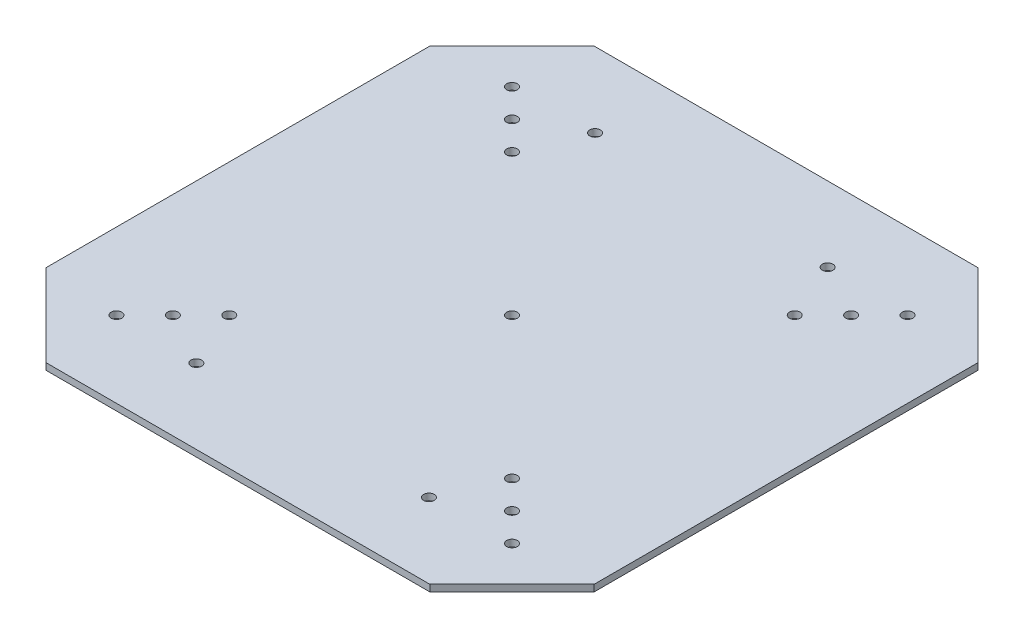
ISO-10303-21;
HEADER;
FILE_DESCRIPTION(('STEP AP214'),'2;1');
FILE_NAME('part.step','',(''),(''),'','','');
FILE_SCHEMA(('AUTOMOTIVE_DESIGN { 1 0 10303 214 1 1 1 1 }'));
ENDSEC;
DATA;
#1=APPLICATION_CONTEXT('core data for automotive mechanical design processes');
#2=APPLICATION_PROTOCOL_DEFINITION('international standard','automotive_design',2000,#1);
#3=PRODUCT_CONTEXT('',#1,'mechanical');
#4=PRODUCT('Part','Part','',(#3));
#5=PRODUCT_RELATED_PRODUCT_CATEGORY('part','',(#4));
#6=PRODUCT_DEFINITION_FORMATION('','',#4);
#7=PRODUCT_DEFINITION_CONTEXT('part definition',#1,'design');
#8=PRODUCT_DEFINITION('design','',#6,#7);
#9=PRODUCT_DEFINITION_SHAPE('','',#8);
#10=(LENGTH_UNIT() NAMED_UNIT(*) SI_UNIT(.MILLI.,.METRE.));
#11=(NAMED_UNIT(*) PLANE_ANGLE_UNIT() SI_UNIT($,.RADIAN.));
#12=(NAMED_UNIT(*) SI_UNIT($,.STERADIAN.) SOLID_ANGLE_UNIT());
#13=UNCERTAINTY_MEASURE_WITH_UNIT(LENGTH_MEASURE(1.E-05),#10,'distance_accuracy_value','');
#14=(GEOMETRIC_REPRESENTATION_CONTEXT(3) GLOBAL_UNCERTAINTY_ASSIGNED_CONTEXT((#13)) GLOBAL_UNIT_ASSIGNED_CONTEXT((#10,
#11,#12)) REPRESENTATION_CONTEXT('',''));
#15=CARTESIAN_POINT('',(0.,0.,0.));
#16=DIRECTION('',(0.,0.,1.));
#17=DIRECTION('',(1.,0.,0.));
#18=AXIS2_PLACEMENT_3D('',#15,#16,#17);
#19=CARTESIAN_POINT('',(0.,0.,0.));
#20=DIRECTION('',(0.,-1.,0.));
#21=DIRECTION('',(0.,0.,-1.));
#22=AXIS2_PLACEMENT_3D('',#19,#20,#21);
#23=PLANE('',#22);
#24=CARTESIAN_POINT('',(0.,0.,0.));
#25=DIRECTION('',(0.,1.,0.));
#26=DIRECTION('',(0.,0.,1.));
#27=AXIS2_PLACEMENT_3D('',#24,#25,#26);
#28=CIRCLE('',#27,1.59999999999999);
#29=CARTESIAN_POINT('',(0.,0.,1.59999999999999));
#30=VERTEX_POINT('',#29);
#31=EDGE_CURVE('E274',#30,#30,#28,.T.);
#32=ORIENTED_EDGE('',*,*,#31,.T.);
#33=EDGE_LOOP('',(#32));
#34=FACE_BOUND('',#33,.T.);
#35=CARTESIAN_POINT('',(-35.,0.,-60.));
#36=DIRECTION('',(0.,1.,0.));
#37=DIRECTION('',(0.,0.,1.));
#38=AXIS2_PLACEMENT_3D('',#35,#36,#37);
#39=CIRCLE('',#38,1.59999999999998);
#40=CARTESIAN_POINT('',(-35.,0.,-58.4));
#41=VERTEX_POINT('',#40);
#42=EDGE_CURVE('E268',#41,#41,#39,.T.);
#43=ORIENTED_EDGE('',*,*,#42,.T.);
#44=EDGE_LOOP('',(#43));
#45=FACE_BOUND('',#44,.T.);
#46=CARTESIAN_POINT('',(35.,0.,60.));
#47=DIRECTION('',(0.,1.,0.));
#48=DIRECTION('',(0.,0.,1.));
#49=AXIS2_PLACEMENT_3D('',#46,#47,#48);
#50=CIRCLE('',#49,1.59999999999998);
#51=CARTESIAN_POINT('',(35.,0.,61.6));
#52=VERTEX_POINT('',#51);
#53=EDGE_CURVE('E262',#52,#52,#50,.T.);
#54=ORIENTED_EDGE('',*,*,#53,.T.);
#55=EDGE_LOOP('',(#54));
#56=FACE_BOUND('',#55,.T.);
#57=CARTESIAN_POINT('',(35.,0.,-60.));
#58=DIRECTION('',(0.,1.,0.));
#59=DIRECTION('',(0.,0.,1.));
#60=AXIS2_PLACEMENT_3D('',#57,#58,#59);
#61=CIRCLE('',#60,1.59999999999998);
#62=CARTESIAN_POINT('',(35.,0.,-58.4));
#63=VERTEX_POINT('',#62);
#64=EDGE_CURVE('E256',#63,#63,#61,.T.);
#65=ORIENTED_EDGE('',*,*,#64,.T.);
#66=EDGE_LOOP('',(#65));
#67=FACE_BOUND('',#66,.T.);
#68=DIRECTION('',(-0.707106781186548,0.,-0.707106781186548));
#69=VECTOR('',#68,1.);
#70=CARTESIAN_POINT('',(57.7512626584708,0.,-82.5));
#71=LINE('',#70,#69);
#72=CARTESIAN_POINT('',(82.5,0.,-57.7512626584708));
#73=VERTEX_POINT('',#72);
#74=CARTESIAN_POINT('',(57.7512626584708,0.,-82.5));
#75=VERTEX_POINT('',#74);
#76=EDGE_CURVE('E131',#73,#75,#71,.T.);
#77=ORIENTED_EDGE('',*,*,#76,.F.);
#78=DIRECTION('',(0.,0.,-1.));
#79=VECTOR('',#78,1.);
#80=CARTESIAN_POINT('',(82.5,0.,-57.7512626584708));
#81=LINE('',#80,#79);
#82=CARTESIAN_POINT('',(82.5,0.,57.7512626584708));
#83=VERTEX_POINT('',#82);
#84=EDGE_CURVE('E85',#83,#73,#81,.T.);
#85=ORIENTED_EDGE('',*,*,#84,.F.);
#86=DIRECTION('',(0.707106781186548,0.,-0.707106781186548));
#87=VECTOR('',#86,1.);
#88=CARTESIAN_POINT('',(82.5,0.,57.7512626584708));
#89=LINE('',#88,#87);
#90=CARTESIAN_POINT('',(57.7512626584708,0.,82.5));
#91=VERTEX_POINT('',#90);
#92=EDGE_CURVE('E79',#91,#83,#89,.T.);
#93=ORIENTED_EDGE('',*,*,#92,.F.);
#94=DIRECTION('',(1.,0.,0.));
#95=VECTOR('',#94,1.);
#96=CARTESIAN_POINT('',(-57.7512626584709,0.,82.5));
#97=LINE('',#96,#95);
#98=CARTESIAN_POINT('',(-57.7512626584709,0.,82.5));
#99=VERTEX_POINT('',#98);
#100=EDGE_CURVE('E121',#99,#91,#97,.T.);
#101=ORIENTED_EDGE('',*,*,#100,.F.);
#102=DIRECTION('',(0.707106781186548,0.,0.707106781186548));
#103=VECTOR('',#102,1.);
#104=CARTESIAN_POINT('',(-82.5,0.,57.7512626584708));
#105=LINE('',#104,#103);
#106=CARTESIAN_POINT('',(-82.5,0.,57.7512626584708));
#107=VERTEX_POINT('',#106);
#108=EDGE_CURVE('E141',#107,#99,#105,.T.);
#109=ORIENTED_EDGE('',*,*,#108,.F.);
#110=DIRECTION('',(0.,0.,1.));
#111=VECTOR('',#110,1.);
#112=CARTESIAN_POINT('',(-82.5,0.,-57.7512626584708));
#113=LINE('',#112,#111);
#114=CARTESIAN_POINT('',(-82.5,0.,-57.7512626584708));
#115=VERTEX_POINT('',#114);
#116=EDGE_CURVE('E139',#115,#107,#113,.T.);
#117=ORIENTED_EDGE('',*,*,#116,.F.);
#118=DIRECTION('',(-0.707106781186548,0.,0.707106781186548));
#119=VECTOR('',#118,1.);
#120=CARTESIAN_POINT('',(-57.7512626584709,0.,-82.5));
#121=LINE('',#120,#119);
#122=CARTESIAN_POINT('',(-57.7512626584709,0.,-82.5));
#123=VERTEX_POINT('',#122);
#124=EDGE_CURVE('E137',#123,#115,#121,.T.);
#125=ORIENTED_EDGE('',*,*,#124,.F.);
#126=DIRECTION('',(-1.,0.,0.));
#127=VECTOR('',#126,1.);
#128=CARTESIAN_POINT('',(-57.7512626584709,0.,-82.5));
#129=LINE('',#128,#127);
#130=EDGE_CURVE('E134',#75,#123,#129,.T.);
#131=ORIENTED_EDGE('',*,*,#130,.F.);
#132=EDGE_LOOP('',(#77,#85,#93,#101,#109,#117,#125,#131));
#133=FACE_BOUND('',#132,.T.);
#134=CARTESIAN_POINT('',(-42.5484668629601,0.,42.5484668629601));
#135=DIRECTION('',(0.,-1.,0.));
#136=DIRECTION('',(0.,0.,-1.));
#137=AXIS2_PLACEMENT_3D('',#134,#135,#136);
#138=CIRCLE('',#137,1.59999999999999);
#139=CARTESIAN_POINT('',(-42.5484668629601,0.,40.9484668629601));
#140=VERTEX_POINT('',#139);
#141=EDGE_CURVE('E181',#140,#140,#138,.T.);
#142=ORIENTED_EDGE('',*,*,#141,.F.);
#143=EDGE_LOOP('',(#142));
#144=FACE_BOUND('',#143,.T.);
#145=CARTESIAN_POINT('',(-51.0337482371987,0.,51.0337482371986));
#146=DIRECTION('',(0.,-1.,0.));
#147=DIRECTION('',(0.,0.,-1.));
#148=AXIS2_PLACEMENT_3D('',#145,#146,#147);
#149=CIRCLE('',#148,1.59999999999999);
#150=CARTESIAN_POINT('',(-51.0337482371987,0.,49.4337482371986));
#151=VERTEX_POINT('',#150);
#152=EDGE_CURVE('E187',#151,#151,#149,.T.);
#153=ORIENTED_EDGE('',*,*,#152,.F.);
#154=EDGE_LOOP('',(#153));
#155=FACE_BOUND('',#154,.T.);
#156=CARTESIAN_POINT('',(-59.5190296114372,0.,59.5190296114372));
#157=DIRECTION('',(0.,-1.,0.));
#158=DIRECTION('',(0.,0.,-1.));
#159=AXIS2_PLACEMENT_3D('',#156,#157,#158);
#160=CIRCLE('',#159,1.59999999999999);
#161=CARTESIAN_POINT('',(-59.5190296114372,0.,57.9190296114372));
#162=VERTEX_POINT('',#161);
#163=EDGE_CURVE('E193',#162,#162,#160,.T.);
#164=ORIENTED_EDGE('',*,*,#163,.F.);
#165=EDGE_LOOP('',(#164));
#166=FACE_BOUND('',#165,.T.);
#167=CARTESIAN_POINT('',(42.54846686296,0.,-42.5484668629601));
#168=DIRECTION('',(0.,-1.,0.));
#169=DIRECTION('',(0.,0.,-1.));
#170=AXIS2_PLACEMENT_3D('',#167,#168,#169);
#171=CIRCLE('',#170,1.59999999999999);
#172=CARTESIAN_POINT('',(42.54846686296,0.,-44.1484668629601));
#173=VERTEX_POINT('',#172);
#174=EDGE_CURVE('E199',#173,#173,#171,.T.);
#175=ORIENTED_EDGE('',*,*,#174,.F.);
#176=EDGE_LOOP('',(#175));
#177=FACE_BOUND('',#176,.T.);
#178=CARTESIAN_POINT('',(51.0337482371986,0.,-51.0337482371987));
#179=DIRECTION('',(0.,-1.,0.));
#180=DIRECTION('',(0.,0.,-1.));
#181=AXIS2_PLACEMENT_3D('',#178,#179,#180);
#182=CIRCLE('',#181,1.59999999999999);
#183=CARTESIAN_POINT('',(51.0337482371986,0.,-52.6337482371987));
#184=VERTEX_POINT('',#183);
#185=EDGE_CURVE('E205',#184,#184,#182,.T.);
#186=ORIENTED_EDGE('',*,*,#185,.F.);
#187=EDGE_LOOP('',(#186));
#188=FACE_BOUND('',#187,.T.);
#189=CARTESIAN_POINT('',(59.5190296114372,0.,-59.5190296114372));
#190=DIRECTION('',(0.,-1.,0.));
#191=DIRECTION('',(0.,0.,-1.));
#192=AXIS2_PLACEMENT_3D('',#189,#190,#191);
#193=CIRCLE('',#192,1.59999999999998);
#194=CARTESIAN_POINT('',(59.5190296114372,0.,-61.1190296114372));
#195=VERTEX_POINT('',#194);
#196=EDGE_CURVE('E211',#195,#195,#193,.T.);
#197=ORIENTED_EDGE('',*,*,#196,.F.);
#198=EDGE_LOOP('',(#197));
#199=FACE_BOUND('',#198,.T.);
#200=CARTESIAN_POINT('',(42.54846686296,0.,42.5484668629601));
#201=DIRECTION('',(0.,-1.,0.));
#202=DIRECTION('',(0.,0.,-1.));
#203=AXIS2_PLACEMENT_3D('',#200,#201,#202);
#204=CIRCLE('',#203,1.59999999999998);
#205=CARTESIAN_POINT('',(42.54846686296,0.,40.9484668629601));
#206=VERTEX_POINT('',#205);
#207=EDGE_CURVE('E217',#206,#206,#204,.T.);
#208=ORIENTED_EDGE('',*,*,#207,.F.);
#209=EDGE_LOOP('',(#208));
#210=FACE_BOUND('',#209,.T.);
#211=CARTESIAN_POINT('',(51.0337482371986,0.,51.0337482371987));
#212=DIRECTION('',(0.,-1.,0.));
#213=DIRECTION('',(0.,0.,-1.));
#214=AXIS2_PLACEMENT_3D('',#211,#212,#213);
#215=CIRCLE('',#214,1.59999999999998);
#216=CARTESIAN_POINT('',(51.0337482371986,0.,49.4337482371987));
#217=VERTEX_POINT('',#216);
#218=EDGE_CURVE('E223',#217,#217,#215,.T.);
#219=ORIENTED_EDGE('',*,*,#218,.F.);
#220=EDGE_LOOP('',(#219));
#221=FACE_BOUND('',#220,.T.);
#222=CARTESIAN_POINT('',(59.5190296114372,0.,59.5190296114372));
#223=DIRECTION('',(0.,-1.,0.));
#224=DIRECTION('',(0.,0.,-1.));
#225=AXIS2_PLACEMENT_3D('',#222,#223,#224);
#226=CIRCLE('',#225,1.59999999999998);
#227=CARTESIAN_POINT('',(59.5190296114372,0.,57.9190296114372));
#228=VERTEX_POINT('',#227);
#229=EDGE_CURVE('E229',#228,#228,#226,.T.);
#230=ORIENTED_EDGE('',*,*,#229,.F.);
#231=EDGE_LOOP('',(#230));
#232=FACE_BOUND('',#231,.T.);
#233=CARTESIAN_POINT('',(-42.5484668629601,0.,-42.5484668629601));
#234=DIRECTION('',(0.,-1.,0.));
#235=DIRECTION('',(0.,0.,-1.));
#236=AXIS2_PLACEMENT_3D('',#233,#234,#235);
#237=CIRCLE('',#236,1.59999999999999);
#238=CARTESIAN_POINT('',(-42.5484668629601,0.,-44.1484668629601));
#239=VERTEX_POINT('',#238);
#240=EDGE_CURVE('E235',#239,#239,#237,.T.);
#241=ORIENTED_EDGE('',*,*,#240,.F.);
#242=EDGE_LOOP('',(#241));
#243=FACE_BOUND('',#242,.T.);
#244=CARTESIAN_POINT('',(-51.0337482371987,0.,-51.0337482371986));
#245=DIRECTION('',(0.,-1.,0.));
#246=DIRECTION('',(0.,0.,-1.));
#247=AXIS2_PLACEMENT_3D('',#244,#245,#246);
#248=CIRCLE('',#247,1.59999999999999);
#249=CARTESIAN_POINT('',(-51.0337482371987,0.,-52.6337482371986));
#250=VERTEX_POINT('',#249);
#251=EDGE_CURVE('E241',#250,#250,#248,.T.);
#252=ORIENTED_EDGE('',*,*,#251,.F.);
#253=EDGE_LOOP('',(#252));
#254=FACE_BOUND('',#253,.T.);
#255=CARTESIAN_POINT('',(-59.5190296114373,0.,-59.5190296114372));
#256=DIRECTION('',(0.,-1.,0.));
#257=DIRECTION('',(0.,0.,-1.));
#258=AXIS2_PLACEMENT_3D('',#255,#256,#257);
#259=CIRCLE('',#258,1.59999999999998);
#260=CARTESIAN_POINT('',(-59.5190296114373,0.,-61.1190296114372));
#261=VERTEX_POINT('',#260);
#262=EDGE_CURVE('E247',#261,#261,#259,.T.);
#263=ORIENTED_EDGE('',*,*,#262,.F.);
#264=EDGE_LOOP('',(#263));
#265=FACE_BOUND('',#264,.T.);
#266=CARTESIAN_POINT('',(-35.,0.,60.));
#267=DIRECTION('',(0.,1.,0.));
#268=DIRECTION('',(0.,0.,1.));
#269=AXIS2_PLACEMENT_3D('',#266,#267,#268);
#270=CIRCLE('',#269,1.59999999999998);
#271=CARTESIAN_POINT('',(-35.,0.,61.6));
#272=VERTEX_POINT('',#271);
#273=EDGE_CURVE('E250',#272,#272,#270,.T.);
#274=ORIENTED_EDGE('',*,*,#273,.T.);
#275=EDGE_LOOP('',(#274));
#276=FACE_BOUND('',#275,.T.);
#277=ADVANCED_FACE('F33',(#34,#45,#56,#67,#133,#144,#155,#166,#177,#188,#199,#210,#221,#232,
#243,#254,#265,#276),#23,.T.);
#278=CARTESIAN_POINT('',(0.,2.,0.));
#279=DIRECTION('',(0.,-1.,0.));
#280=DIRECTION('',(0.,0.,-1.));
#281=AXIS2_PLACEMENT_3D('',#278,#279,#280);
#282=PLANE('',#281);
#283=CARTESIAN_POINT('',(0.,2.,0.));
#284=DIRECTION('',(0.,1.,0.));
#285=DIRECTION('',(0.,0.,1.));
#286=AXIS2_PLACEMENT_3D('',#283,#284,#285);
#287=CIRCLE('',#286,1.59999999999999);
#288=CARTESIAN_POINT('',(0.,2.,1.59999999999999));
#289=VERTEX_POINT('',#288);
#290=EDGE_CURVE('E277',#289,#289,#287,.T.);
#291=ORIENTED_EDGE('',*,*,#290,.F.);
#292=EDGE_LOOP('',(#291));
#293=FACE_BOUND('',#292,.T.);
#294=CARTESIAN_POINT('',(-35.,2.,-60.));
#295=DIRECTION('',(0.,1.,0.));
#296=DIRECTION('',(0.,0.,1.));
#297=AXIS2_PLACEMENT_3D('',#294,#295,#296);
#298=CIRCLE('',#297,1.59999999999998);
#299=CARTESIAN_POINT('',(-35.,2.,-58.4));
#300=VERTEX_POINT('',#299);
#301=EDGE_CURVE('E271',#300,#300,#298,.T.);
#302=ORIENTED_EDGE('',*,*,#301,.F.);
#303=EDGE_LOOP('',(#302));
#304=FACE_BOUND('',#303,.T.);
#305=CARTESIAN_POINT('',(35.,2.,60.));
#306=DIRECTION('',(0.,1.,0.));
#307=DIRECTION('',(0.,0.,1.));
#308=AXIS2_PLACEMENT_3D('',#305,#306,#307);
#309=CIRCLE('',#308,1.59999999999998);
#310=CARTESIAN_POINT('',(35.,2.,61.6));
#311=VERTEX_POINT('',#310);
#312=EDGE_CURVE('E265',#311,#311,#309,.T.);
#313=ORIENTED_EDGE('',*,*,#312,.F.);
#314=EDGE_LOOP('',(#313));
#315=FACE_BOUND('',#314,.T.);
#316=CARTESIAN_POINT('',(35.,2.,-60.));
#317=DIRECTION('',(0.,1.,0.));
#318=DIRECTION('',(0.,0.,1.));
#319=AXIS2_PLACEMENT_3D('',#316,#317,#318);
#320=CIRCLE('',#319,1.59999999999998);
#321=CARTESIAN_POINT('',(35.,2.,-58.4));
#322=VERTEX_POINT('',#321);
#323=EDGE_CURVE('E259',#322,#322,#320,.T.);
#324=ORIENTED_EDGE('',*,*,#323,.F.);
#325=EDGE_LOOP('',(#324));
#326=FACE_BOUND('',#325,.T.);
#327=CARTESIAN_POINT('',(-59.5190296114373,2.,-59.5190296114372));
#328=DIRECTION('',(0.,-1.,0.));
#329=DIRECTION('',(0.,0.,-1.));
#330=AXIS2_PLACEMENT_3D('',#327,#328,#329);
#331=CIRCLE('',#330,1.6);
#332=CARTESIAN_POINT('',(-59.5190296114373,2.,-61.1190296114372));
#333=VERTEX_POINT('',#332);
#334=EDGE_CURVE('E244',#333,#333,#331,.T.);
#335=ORIENTED_EDGE('',*,*,#334,.T.);
#336=EDGE_LOOP('',(#335));
#337=FACE_BOUND('',#336,.T.);
#338=CARTESIAN_POINT('',(-51.0337482371987,2.,-51.0337482371986));
#339=DIRECTION('',(0.,-1.,0.));
#340=DIRECTION('',(0.,0.,-1.));
#341=AXIS2_PLACEMENT_3D('',#338,#339,#340);
#342=CIRCLE('',#341,1.6);
#343=CARTESIAN_POINT('',(-51.0337482371987,2.,-52.6337482371986));
#344=VERTEX_POINT('',#343);
#345=EDGE_CURVE('E238',#344,#344,#342,.T.);
#346=ORIENTED_EDGE('',*,*,#345,.T.);
#347=EDGE_LOOP('',(#346));
#348=FACE_BOUND('',#347,.T.);
#349=CARTESIAN_POINT('',(-42.5484668629601,2.,-42.5484668629601));
#350=DIRECTION('',(0.,-1.,0.));
#351=DIRECTION('',(0.,0.,-1.));
#352=AXIS2_PLACEMENT_3D('',#349,#350,#351);
#353=CIRCLE('',#352,1.6);
#354=CARTESIAN_POINT('',(-42.5484668629601,2.,-44.1484668629601));
#355=VERTEX_POINT('',#354);
#356=EDGE_CURVE('E232',#355,#355,#353,.T.);
#357=ORIENTED_EDGE('',*,*,#356,.T.);
#358=EDGE_LOOP('',(#357));
#359=FACE_BOUND('',#358,.T.);
#360=CARTESIAN_POINT('',(59.5190296114372,2.,59.5190296114372));
#361=DIRECTION('',(0.,-1.,0.));
#362=DIRECTION('',(0.,0.,-1.));
#363=AXIS2_PLACEMENT_3D('',#360,#361,#362);
#364=CIRCLE('',#363,1.6);
#365=CARTESIAN_POINT('',(59.5190296114372,2.,57.9190296114372));
#366=VERTEX_POINT('',#365);
#367=EDGE_CURVE('E226',#366,#366,#364,.T.);
#368=ORIENTED_EDGE('',*,*,#367,.T.);
#369=EDGE_LOOP('',(#368));
#370=FACE_BOUND('',#369,.T.);
#371=CARTESIAN_POINT('',(51.0337482371986,2.,51.0337482371987));
#372=DIRECTION('',(0.,-1.,0.));
#373=DIRECTION('',(0.,0.,-1.));
#374=AXIS2_PLACEMENT_3D('',#371,#372,#373);
#375=CIRCLE('',#374,1.6);
#376=CARTESIAN_POINT('',(51.0337482371986,2.,49.4337482371987));
#377=VERTEX_POINT('',#376);
#378=EDGE_CURVE('E220',#377,#377,#375,.T.);
#379=ORIENTED_EDGE('',*,*,#378,.T.);
#380=EDGE_LOOP('',(#379));
#381=FACE_BOUND('',#380,.T.);
#382=CARTESIAN_POINT('',(42.54846686296,2.,42.5484668629601));
#383=DIRECTION('',(0.,-1.,0.));
#384=DIRECTION('',(0.,0.,-1.));
#385=AXIS2_PLACEMENT_3D('',#382,#383,#384);
#386=CIRCLE('',#385,1.6);
#387=CARTESIAN_POINT('',(42.54846686296,2.,40.9484668629601));
#388=VERTEX_POINT('',#387);
#389=EDGE_CURVE('E214',#388,#388,#386,.T.);
#390=ORIENTED_EDGE('',*,*,#389,.T.);
#391=EDGE_LOOP('',(#390));
#392=FACE_BOUND('',#391,.T.);
#393=CARTESIAN_POINT('',(59.5190296114372,2.,-59.5190296114372));
#394=DIRECTION('',(0.,-1.,0.));
#395=DIRECTION('',(0.,0.,-1.));
#396=AXIS2_PLACEMENT_3D('',#393,#394,#395);
#397=CIRCLE('',#396,1.6);
#398=CARTESIAN_POINT('',(59.5190296114372,2.,-61.1190296114372));
#399=VERTEX_POINT('',#398);
#400=EDGE_CURVE('E208',#399,#399,#397,.T.);
#401=ORIENTED_EDGE('',*,*,#400,.T.);
#402=EDGE_LOOP('',(#401));
#403=FACE_BOUND('',#402,.T.);
#404=CARTESIAN_POINT('',(51.0337482371986,2.,-51.0337482371987));
#405=DIRECTION('',(0.,-1.,0.));
#406=DIRECTION('',(0.,0.,-1.));
#407=AXIS2_PLACEMENT_3D('',#404,#405,#406);
#408=CIRCLE('',#407,1.6);
#409=CARTESIAN_POINT('',(51.0337482371986,2.,-52.6337482371987));
#410=VERTEX_POINT('',#409);
#411=EDGE_CURVE('E202',#410,#410,#408,.T.);
#412=ORIENTED_EDGE('',*,*,#411,.T.);
#413=EDGE_LOOP('',(#412));
#414=FACE_BOUND('',#413,.T.);
#415=CARTESIAN_POINT('',(42.54846686296,2.,-42.5484668629601));
#416=DIRECTION('',(0.,-1.,0.));
#417=DIRECTION('',(0.,0.,-1.));
#418=AXIS2_PLACEMENT_3D('',#415,#416,#417);
#419=CIRCLE('',#418,1.6);
#420=CARTESIAN_POINT('',(42.54846686296,2.,-44.1484668629601));
#421=VERTEX_POINT('',#420);
#422=EDGE_CURVE('E196',#421,#421,#419,.T.);
#423=ORIENTED_EDGE('',*,*,#422,.T.);
#424=EDGE_LOOP('',(#423));
#425=FACE_BOUND('',#424,.T.);
#426=CARTESIAN_POINT('',(-59.5190296114372,2.,59.5190296114372));
#427=DIRECTION('',(0.,-1.,0.));
#428=DIRECTION('',(0.,0.,-1.));
#429=AXIS2_PLACEMENT_3D('',#426,#427,#428);
#430=CIRCLE('',#429,1.6);
#431=CARTESIAN_POINT('',(-59.5190296114372,2.,57.9190296114372));
#432=VERTEX_POINT('',#431);
#433=EDGE_CURVE('E190',#432,#432,#430,.T.);
#434=ORIENTED_EDGE('',*,*,#433,.T.);
#435=EDGE_LOOP('',(#434));
#436=FACE_BOUND('',#435,.T.);
#437=CARTESIAN_POINT('',(-51.0337482371987,2.,51.0337482371986));
#438=DIRECTION('',(0.,-1.,0.));
#439=DIRECTION('',(0.,0.,-1.));
#440=AXIS2_PLACEMENT_3D('',#437,#438,#439);
#441=CIRCLE('',#440,1.6);
#442=CARTESIAN_POINT('',(-51.0337482371987,2.,49.4337482371986));
#443=VERTEX_POINT('',#442);
#444=EDGE_CURVE('E184',#443,#443,#441,.T.);
#445=ORIENTED_EDGE('',*,*,#444,.T.);
#446=EDGE_LOOP('',(#445));
#447=FACE_BOUND('',#446,.T.);
#448=CARTESIAN_POINT('',(-42.5484668629601,2.,42.5484668629601));
#449=DIRECTION('',(0.,-1.,0.));
#450=DIRECTION('',(0.,0.,-1.));
#451=AXIS2_PLACEMENT_3D('',#448,#449,#450);
#452=CIRCLE('',#451,1.6);
#453=CARTESIAN_POINT('',(-42.5484668629601,2.,40.9484668629601));
#454=VERTEX_POINT('',#453);
#455=EDGE_CURVE('E135',#454,#454,#452,.T.);
#456=ORIENTED_EDGE('',*,*,#455,.T.);
#457=EDGE_LOOP('',(#456));
#458=FACE_BOUND('',#457,.T.);
#459=DIRECTION('',(-0.707106781186548,0.,-0.707106781186548));
#460=VECTOR('',#459,1.);
#461=CARTESIAN_POINT('',(57.7512626584708,2.,-82.5));
#462=LINE('',#461,#460);
#463=CARTESIAN_POINT('',(82.5,2.,-57.7512626584708));
#464=VERTEX_POINT('',#463);
#465=CARTESIAN_POINT('',(57.7512626584708,2.,-82.5));
#466=VERTEX_POINT('',#465);
#467=EDGE_CURVE('E146',#464,#466,#462,.T.);
#468=ORIENTED_EDGE('',*,*,#467,.T.);
#469=DIRECTION('',(-1.,0.,0.));
#470=VECTOR('',#469,1.);
#471=CARTESIAN_POINT('',(-57.7512626584709,2.,-82.5));
#472=LINE('',#471,#470);
#473=CARTESIAN_POINT('',(-57.7512626584709,2.,-82.5));
#474=VERTEX_POINT('',#473);
#475=EDGE_CURVE('E93',#466,#474,#472,.T.);
#476=ORIENTED_EDGE('',*,*,#475,.T.);
#477=DIRECTION('',(-0.707106781186548,0.,0.707106781186548));
#478=VECTOR('',#477,1.);
#479=CARTESIAN_POINT('',(-57.7512626584709,2.,-82.5));
#480=LINE('',#479,#478);
#481=CARTESIAN_POINT('',(-82.5,2.,-57.7512626584708));
#482=VERTEX_POINT('',#481);
#483=EDGE_CURVE('E161',#474,#482,#480,.T.);
#484=ORIENTED_EDGE('',*,*,#483,.T.);
#485=DIRECTION('',(0.,0.,1.));
#486=VECTOR('',#485,1.);
#487=CARTESIAN_POINT('',(-82.5,2.,-57.7512626584708));
#488=LINE('',#487,#486);
#489=CARTESIAN_POINT('',(-82.5,2.,57.7512626584708));
#490=VERTEX_POINT('',#489);
#491=EDGE_CURVE('E173',#482,#490,#488,.T.);
#492=ORIENTED_EDGE('',*,*,#491,.T.);
#493=DIRECTION('',(0.707106781186548,0.,0.707106781186548));
#494=VECTOR('',#493,1.);
#495=CARTESIAN_POINT('',(-82.5,2.,57.7512626584708));
#496=LINE('',#495,#494);
#497=CARTESIAN_POINT('',(-57.7512626584709,2.,82.5));
#498=VERTEX_POINT('',#497);
#499=EDGE_CURVE('E113',#490,#498,#496,.T.);
#500=ORIENTED_EDGE('',*,*,#499,.T.);
#501=DIRECTION('',(1.,0.,0.));
#502=VECTOR('',#501,1.);
#503=CARTESIAN_POINT('',(-57.7512626584709,2.,82.5));
#504=LINE('',#503,#502);
#505=CARTESIAN_POINT('',(57.7512626584708,2.,82.5));
#506=VERTEX_POINT('',#505);
#507=EDGE_CURVE('E106',#498,#506,#504,.T.);
#508=ORIENTED_EDGE('',*,*,#507,.T.);
#509=DIRECTION('',(0.707106781186548,0.,-0.707106781186548));
#510=VECTOR('',#509,1.);
#511=CARTESIAN_POINT('',(82.5,2.,57.7512626584708));
#512=LINE('',#511,#510);
#513=CARTESIAN_POINT('',(82.5,2.,57.7512626584708));
#514=VERTEX_POINT('',#513);
#515=EDGE_CURVE('E111',#506,#514,#512,.T.);
#516=ORIENTED_EDGE('',*,*,#515,.T.);
#517=DIRECTION('',(0.,0.,-1.));
#518=VECTOR('',#517,1.);
#519=CARTESIAN_POINT('',(82.5,2.,-57.7512626584708));
#520=LINE('',#519,#518);
#521=EDGE_CURVE('E50',#514,#464,#520,.T.);
#522=ORIENTED_EDGE('',*,*,#521,.T.);
#523=EDGE_LOOP('',(#468,#476,#484,#492,#500,#508,#516,#522));
#524=FACE_BOUND('',#523,.T.);
#525=CARTESIAN_POINT('',(-35.,2.,60.));
#526=DIRECTION('',(0.,1.,0.));
#527=DIRECTION('',(0.,0.,1.));
#528=AXIS2_PLACEMENT_3D('',#525,#526,#527);
#529=CIRCLE('',#528,1.59999999999998);
#530=CARTESIAN_POINT('',(-35.,2.,61.6));
#531=VERTEX_POINT('',#530);
#532=EDGE_CURVE('E253',#531,#531,#529,.T.);
#533=ORIENTED_EDGE('',*,*,#532,.F.);
#534=EDGE_LOOP('',(#533));
#535=FACE_BOUND('',#534,.T.);
#536=ADVANCED_FACE('F108',(#293,#304,#315,#326,#337,#348,#359,#370,#381,#392,#403,#414,#425,
#436,#447,#458,#524,#535),#282,.F.);
#537=CARTESIAN_POINT('',(57.7512626584708,2.,-82.5));
#538=DIRECTION('',(-0.707106781186547,0.,0.707106781186547));
#539=DIRECTION('',(0.707106781186548,0.,0.707106781186548));
#540=AXIS2_PLACEMENT_3D('',#537,#538,#539);
#541=PLANE('',#540);
#542=ORIENTED_EDGE('',*,*,#76,.T.);
#543=DIRECTION('',(0.,-1.,0.));
#544=VECTOR('',#543,1.);
#545=CARTESIAN_POINT('',(57.7512626584708,2.,-82.5));
#546=LINE('',#545,#544);
#547=EDGE_CURVE('E11',#466,#75,#546,.T.);
#548=ORIENTED_EDGE('',*,*,#547,.F.);
#549=ORIENTED_EDGE('',*,*,#467,.F.);
#550=DIRECTION('',(0.,-1.,0.));
#551=VECTOR('',#550,1.);
#552=CARTESIAN_POINT('',(82.5,2.,-57.7512626584708));
#553=LINE('',#552,#551);
#554=EDGE_CURVE('E127',#464,#73,#553,.T.);
#555=ORIENTED_EDGE('',*,*,#554,.T.);
#556=EDGE_LOOP('',(#542,#548,#549,#555));
#557=FACE_BOUND('',#556,.T.);
#558=ADVANCED_FACE('F35',(#557),#541,.F.);
#559=CARTESIAN_POINT('',(-57.7512626584709,2.,-82.5));
#560=DIRECTION('',(0.,0.,1.));
#561=DIRECTION('',(1.,0.,0.));
#562=AXIS2_PLACEMENT_3D('',#559,#560,#561);
#563=PLANE('',#562);
#564=ORIENTED_EDGE('',*,*,#130,.T.);
#565=DIRECTION('',(0.,-1.,0.));
#566=VECTOR('',#565,1.);
#567=CARTESIAN_POINT('',(-57.7512626584709,2.,-82.5));
#568=LINE('',#567,#566);
#569=EDGE_CURVE('E42',#474,#123,#568,.T.);
#570=ORIENTED_EDGE('',*,*,#569,.F.);
#571=ORIENTED_EDGE('',*,*,#475,.F.);
#572=ORIENTED_EDGE('',*,*,#547,.T.);
#573=EDGE_LOOP('',(#564,#570,#571,#572));
#574=FACE_BOUND('',#573,.T.);
#575=ADVANCED_FACE('F420',(#574),#563,.F.);
#576=CARTESIAN_POINT('',(-57.7512626584709,2.,-82.5));
#577=DIRECTION('',(0.707106781186547,0.,0.707106781186547));
#578=DIRECTION('',(0.707106781186548,0.,-0.707106781186548));
#579=AXIS2_PLACEMENT_3D('',#576,#577,#578);
#580=PLANE('',#579);
#581=ORIENTED_EDGE('',*,*,#124,.T.);
#582=DIRECTION('',(0.,-1.,0.));
#583=VECTOR('',#582,1.);
#584=CARTESIAN_POINT('',(-82.5,2.,-57.7512626584708));
#585=LINE('',#584,#583);
#586=EDGE_CURVE('E153',#482,#115,#585,.T.);
#587=ORIENTED_EDGE('',*,*,#586,.F.);
#588=ORIENTED_EDGE('',*,*,#483,.F.);
#589=ORIENTED_EDGE('',*,*,#569,.T.);
#590=EDGE_LOOP('',(#581,#587,#588,#589));
#591=FACE_BOUND('',#590,.T.);
#592=ADVANCED_FACE('F159',(#591),#580,.F.);
#593=CARTESIAN_POINT('',(-82.5,2.,-57.7512626584708));
#594=DIRECTION('',(1.,0.,0.));
#595=DIRECTION('',(0.,0.,-1.));
#596=AXIS2_PLACEMENT_3D('',#593,#594,#595);
#597=PLANE('',#596);
#598=ORIENTED_EDGE('',*,*,#116,.T.);
#599=DIRECTION('',(0.,-1.,0.));
#600=VECTOR('',#599,1.);
#601=CARTESIAN_POINT('',(-82.5,2.,57.7512626584708));
#602=LINE('',#601,#600);
#603=EDGE_CURVE('E150',#490,#107,#602,.T.);
#604=ORIENTED_EDGE('',*,*,#603,.F.);
#605=ORIENTED_EDGE('',*,*,#491,.F.);
#606=ORIENTED_EDGE('',*,*,#586,.T.);
#607=EDGE_LOOP('',(#598,#604,#605,#606));
#608=FACE_BOUND('',#607,.T.);
#609=ADVANCED_FACE('F169',(#608),#597,.F.);
#610=CARTESIAN_POINT('',(-82.5,2.,57.7512626584708));
#611=DIRECTION('',(0.707106781186547,0.,-0.707106781186547));
#612=DIRECTION('',(-0.707106781186548,0.,-0.707106781186548));
#613=AXIS2_PLACEMENT_3D('',#610,#611,#612);
#614=PLANE('',#613);
#615=ORIENTED_EDGE('',*,*,#108,.T.);
#616=DIRECTION('',(0.,-1.,0.));
#617=VECTOR('',#616,1.);
#618=CARTESIAN_POINT('',(-57.7512626584709,2.,82.5));
#619=LINE('',#618,#617);
#620=EDGE_CURVE('E122',#498,#99,#619,.T.);
#621=ORIENTED_EDGE('',*,*,#620,.F.);
#622=ORIENTED_EDGE('',*,*,#499,.F.);
#623=ORIENTED_EDGE('',*,*,#603,.T.);
#624=EDGE_LOOP('',(#615,#621,#622,#623));
#625=FACE_BOUND('',#624,.T.);
#626=ADVANCED_FACE('F172',(#625),#614,.F.);
#627=CARTESIAN_POINT('',(-57.7512626584709,2.,82.5));
#628=DIRECTION('',(0.,0.,-1.));
#629=DIRECTION('',(-1.,0.,0.));
#630=AXIS2_PLACEMENT_3D('',#627,#628,#629);
#631=PLANE('',#630);
#632=ORIENTED_EDGE('',*,*,#100,.T.);
#633=DIRECTION('',(0.,-1.,0.));
#634=VECTOR('',#633,1.);
#635=CARTESIAN_POINT('',(57.7512626584708,2.,82.5));
#636=LINE('',#635,#634);
#637=EDGE_CURVE('E118',#506,#91,#636,.T.);
#638=ORIENTED_EDGE('',*,*,#637,.F.);
#639=ORIENTED_EDGE('',*,*,#507,.F.);
#640=ORIENTED_EDGE('',*,*,#620,.T.);
#641=EDGE_LOOP('',(#632,#638,#639,#640));
#642=FACE_BOUND('',#641,.T.);
#643=ADVANCED_FACE('F119',(#642),#631,.F.);
#644=CARTESIAN_POINT('',(82.5,2.,57.7512626584708));
#645=DIRECTION('',(-0.707106781186547,0.,-0.707106781186547));
#646=DIRECTION('',(-0.707106781186548,0.,0.707106781186548));
#647=AXIS2_PLACEMENT_3D('',#644,#645,#646);
#648=PLANE('',#647);
#649=ORIENTED_EDGE('',*,*,#92,.T.);
#650=DIRECTION('',(0.,-1.,0.));
#651=VECTOR('',#650,1.);
#652=CARTESIAN_POINT('',(82.5,2.,57.7512626584708));
#653=LINE('',#652,#651);
#654=EDGE_CURVE('E123',#514,#83,#653,.T.);
#655=ORIENTED_EDGE('',*,*,#654,.F.);
#656=ORIENTED_EDGE('',*,*,#515,.F.);
#657=ORIENTED_EDGE('',*,*,#637,.T.);
#658=EDGE_LOOP('',(#649,#655,#656,#657));
#659=FACE_BOUND('',#658,.T.);
#660=ADVANCED_FACE('F125',(#659),#648,.F.);
#661=CARTESIAN_POINT('',(82.5,2.,-57.7512626584708));
#662=DIRECTION('',(-1.,0.,0.));
#663=DIRECTION('',(0.,0.,1.));
#664=AXIS2_PLACEMENT_3D('',#661,#662,#663);
#665=PLANE('',#664);
#666=ORIENTED_EDGE('',*,*,#84,.T.);
#667=ORIENTED_EDGE('',*,*,#554,.F.);
#668=ORIENTED_EDGE('',*,*,#521,.F.);
#669=ORIENTED_EDGE('',*,*,#654,.T.);
#670=EDGE_LOOP('',(#666,#667,#668,#669));
#671=FACE_BOUND('',#670,.T.);
#672=ADVANCED_FACE('F320',(#671),#665,.F.);
#673=CARTESIAN_POINT('',(-42.5484668629601,0.,42.5484668629601));
#674=DIRECTION('',(0.,-1.,0.));
#675=DIRECTION('',(0.,0.,-1.));
#676=AXIS2_PLACEMENT_3D('',#673,#674,#675);
#677=CYLINDRICAL_SURFACE('',#676,1.59999999999999);
#678=ORIENTED_EDGE('',*,*,#455,.F.);
#679=EDGE_LOOP('',(#678));
#680=FACE_BOUND('',#679,.T.);
#681=ORIENTED_EDGE('',*,*,#141,.T.);
#682=EDGE_LOOP('',(#681));
#683=FACE_BOUND('',#682,.T.);
#684=ADVANCED_FACE('F316',(#680,#683),#677,.F.);
#685=CARTESIAN_POINT('',(-51.0337482371987,0.,51.0337482371986));
#686=DIRECTION('',(0.,-1.,0.));
#687=DIRECTION('',(0.,0.,-1.));
#688=AXIS2_PLACEMENT_3D('',#685,#686,#687);
#689=CYLINDRICAL_SURFACE('',#688,1.59999999999999);
#690=ORIENTED_EDGE('',*,*,#444,.F.);
#691=EDGE_LOOP('',(#690));
#692=FACE_BOUND('',#691,.T.);
#693=ORIENTED_EDGE('',*,*,#152,.T.);
#694=EDGE_LOOP('',(#693));
#695=FACE_BOUND('',#694,.T.);
#696=ADVANCED_FACE('F319',(#692,#695),#689,.F.);
#697=CARTESIAN_POINT('',(-59.5190296114372,0.,59.5190296114372));
#698=DIRECTION('',(0.,-1.,0.));
#699=DIRECTION('',(0.,0.,-1.));
#700=AXIS2_PLACEMENT_3D('',#697,#698,#699);
#701=CYLINDRICAL_SURFACE('',#700,1.59999999999999);
#702=ORIENTED_EDGE('',*,*,#433,.F.);
#703=EDGE_LOOP('',(#702));
#704=FACE_BOUND('',#703,.T.);
#705=ORIENTED_EDGE('',*,*,#163,.T.);
#706=EDGE_LOOP('',(#705));
#707=FACE_BOUND('',#706,.T.);
#708=ADVANCED_FACE('F401',(#704,#707),#701,.F.);
#709=CARTESIAN_POINT('',(42.54846686296,0.,-42.5484668629601));
#710=DIRECTION('',(0.,-1.,0.));
#711=DIRECTION('',(0.,0.,-1.));
#712=AXIS2_PLACEMENT_3D('',#709,#710,#711);
#713=CYLINDRICAL_SURFACE('',#712,1.59999999999999);
#714=ORIENTED_EDGE('',*,*,#422,.F.);
#715=EDGE_LOOP('',(#714));
#716=FACE_BOUND('',#715,.T.);
#717=ORIENTED_EDGE('',*,*,#174,.T.);
#718=EDGE_LOOP('',(#717));
#719=FACE_BOUND('',#718,.T.);
#720=ADVANCED_FACE('F397',(#716,#719),#713,.F.);
#721=CARTESIAN_POINT('',(51.0337482371986,0.,-51.0337482371987));
#722=DIRECTION('',(0.,-1.,0.));
#723=DIRECTION('',(0.,0.,-1.));
#724=AXIS2_PLACEMENT_3D('',#721,#722,#723);
#725=CYLINDRICAL_SURFACE('',#724,1.59999999999999);
#726=ORIENTED_EDGE('',*,*,#411,.F.);
#727=EDGE_LOOP('',(#726));
#728=FACE_BOUND('',#727,.T.);
#729=ORIENTED_EDGE('',*,*,#185,.T.);
#730=EDGE_LOOP('',(#729));
#731=FACE_BOUND('',#730,.T.);
#732=ADVANCED_FACE('F393',(#728,#731),#725,.F.);
#733=CARTESIAN_POINT('',(59.5190296114372,0.,-59.5190296114372));
#734=DIRECTION('',(0.,-1.,0.));
#735=DIRECTION('',(0.,0.,-1.));
#736=AXIS2_PLACEMENT_3D('',#733,#734,#735);
#737=CYLINDRICAL_SURFACE('',#736,1.59999999999999);
#738=ORIENTED_EDGE('',*,*,#400,.F.);
#739=EDGE_LOOP('',(#738));
#740=FACE_BOUND('',#739,.T.);
#741=ORIENTED_EDGE('',*,*,#196,.T.);
#742=EDGE_LOOP('',(#741));
#743=FACE_BOUND('',#742,.T.);
#744=ADVANCED_FACE('F389',(#740,#743),#737,.F.);
#745=CARTESIAN_POINT('',(42.54846686296,0.,42.5484668629601));
#746=DIRECTION('',(0.,-1.,0.));
#747=DIRECTION('',(0.,0.,-1.));
#748=AXIS2_PLACEMENT_3D('',#745,#746,#747);
#749=CYLINDRICAL_SURFACE('',#748,1.59999999999999);
#750=ORIENTED_EDGE('',*,*,#389,.F.);
#751=EDGE_LOOP('',(#750));
#752=FACE_BOUND('',#751,.T.);
#753=ORIENTED_EDGE('',*,*,#207,.T.);
#754=EDGE_LOOP('',(#753));
#755=FACE_BOUND('',#754,.T.);
#756=ADVANCED_FACE('F385',(#752,#755),#749,.F.);
#757=CARTESIAN_POINT('',(51.0337482371986,0.,51.0337482371987));
#758=DIRECTION('',(0.,-1.,0.));
#759=DIRECTION('',(0.,0.,-1.));
#760=AXIS2_PLACEMENT_3D('',#757,#758,#759);
#761=CYLINDRICAL_SURFACE('',#760,1.59999999999999);
#762=ORIENTED_EDGE('',*,*,#378,.F.);
#763=EDGE_LOOP('',(#762));
#764=FACE_BOUND('',#763,.T.);
#765=ORIENTED_EDGE('',*,*,#218,.T.);
#766=EDGE_LOOP('',(#765));
#767=FACE_BOUND('',#766,.T.);
#768=ADVANCED_FACE('F381',(#764,#767),#761,.F.);
#769=CARTESIAN_POINT('',(59.5190296114372,0.,59.5190296114372));
#770=DIRECTION('',(0.,-1.,0.));
#771=DIRECTION('',(0.,0.,-1.));
#772=AXIS2_PLACEMENT_3D('',#769,#770,#771);
#773=CYLINDRICAL_SURFACE('',#772,1.59999999999999);
#774=ORIENTED_EDGE('',*,*,#367,.F.);
#775=EDGE_LOOP('',(#774));
#776=FACE_BOUND('',#775,.T.);
#777=ORIENTED_EDGE('',*,*,#229,.T.);
#778=EDGE_LOOP('',(#777));
#779=FACE_BOUND('',#778,.T.);
#780=ADVANCED_FACE('F377',(#776,#779),#773,.F.);
#781=CARTESIAN_POINT('',(-42.5484668629601,0.,-42.5484668629601));
#782=DIRECTION('',(0.,-1.,0.));
#783=DIRECTION('',(0.,0.,-1.));
#784=AXIS2_PLACEMENT_3D('',#781,#782,#783);
#785=CYLINDRICAL_SURFACE('',#784,1.59999999999999);
#786=ORIENTED_EDGE('',*,*,#356,.F.);
#787=EDGE_LOOP('',(#786));
#788=FACE_BOUND('',#787,.T.);
#789=ORIENTED_EDGE('',*,*,#240,.T.);
#790=EDGE_LOOP('',(#789));
#791=FACE_BOUND('',#790,.T.);
#792=ADVANCED_FACE('F373',(#788,#791),#785,.F.);
#793=CARTESIAN_POINT('',(-51.0337482371987,0.,-51.0337482371986));
#794=DIRECTION('',(0.,-1.,0.));
#795=DIRECTION('',(0.,0.,-1.));
#796=AXIS2_PLACEMENT_3D('',#793,#794,#795);
#797=CYLINDRICAL_SURFACE('',#796,1.59999999999999);
#798=ORIENTED_EDGE('',*,*,#345,.F.);
#799=EDGE_LOOP('',(#798));
#800=FACE_BOUND('',#799,.T.);
#801=ORIENTED_EDGE('',*,*,#251,.T.);
#802=EDGE_LOOP('',(#801));
#803=FACE_BOUND('',#802,.T.);
#804=ADVANCED_FACE('F366',(#800,#803),#797,.F.);
#805=CARTESIAN_POINT('',(-59.5190296114373,0.,-59.5190296114372));
#806=DIRECTION('',(0.,-1.,0.));
#807=DIRECTION('',(0.,0.,-1.));
#808=AXIS2_PLACEMENT_3D('',#805,#806,#807);
#809=CYLINDRICAL_SURFACE('',#808,1.59999999999999);
#810=ORIENTED_EDGE('',*,*,#334,.F.);
#811=EDGE_LOOP('',(#810));
#812=FACE_BOUND('',#811,.T.);
#813=ORIENTED_EDGE('',*,*,#262,.T.);
#814=EDGE_LOOP('',(#813));
#815=FACE_BOUND('',#814,.T.);
#816=ADVANCED_FACE('F355',(#812,#815),#809,.F.);
#817=CARTESIAN_POINT('',(-35.,2.,60.));
#818=DIRECTION('',(0.,1.,0.));
#819=DIRECTION('',(0.,0.,1.));
#820=AXIS2_PLACEMENT_3D('',#817,#818,#819);
#821=CYLINDRICAL_SURFACE('',#820,1.59999999999998);
#822=ORIENTED_EDGE('',*,*,#273,.F.);
#823=EDGE_LOOP('',(#822));
#824=FACE_BOUND('',#823,.T.);
#825=ORIENTED_EDGE('',*,*,#532,.T.);
#826=EDGE_LOOP('',(#825));
#827=FACE_BOUND('',#826,.T.);
#828=ADVANCED_FACE('F351',(#824,#827),#821,.F.);
#829=CARTESIAN_POINT('',(35.,2.,-60.));
#830=DIRECTION('',(0.,1.,0.));
#831=DIRECTION('',(0.,0.,1.));
#832=AXIS2_PLACEMENT_3D('',#829,#830,#831);
#833=CYLINDRICAL_SURFACE('',#832,1.59999999999998);
#834=ORIENTED_EDGE('',*,*,#64,.F.);
#835=EDGE_LOOP('',(#834));
#836=FACE_BOUND('',#835,.T.);
#837=ORIENTED_EDGE('',*,*,#323,.T.);
#838=EDGE_LOOP('',(#837));
#839=FACE_BOUND('',#838,.T.);
#840=ADVANCED_FACE('F354',(#836,#839),#833,.F.);
#841=CARTESIAN_POINT('',(35.,2.,60.));
#842=DIRECTION('',(0.,1.,0.));
#843=DIRECTION('',(0.,0.,1.));
#844=AXIS2_PLACEMENT_3D('',#841,#842,#843);
#845=CYLINDRICAL_SURFACE('',#844,1.59999999999998);
#846=ORIENTED_EDGE('',*,*,#53,.F.);
#847=EDGE_LOOP('',(#846));
#848=FACE_BOUND('',#847,.T.);
#849=ORIENTED_EDGE('',*,*,#312,.T.);
#850=EDGE_LOOP('',(#849));
#851=FACE_BOUND('',#850,.T.);
#852=ADVANCED_FACE('F362',(#848,#851),#845,.F.);
#853=CARTESIAN_POINT('',(-35.,2.,-60.));
#854=DIRECTION('',(0.,1.,0.));
#855=DIRECTION('',(0.,0.,1.));
#856=AXIS2_PLACEMENT_3D('',#853,#854,#855);
#857=CYLINDRICAL_SURFACE('',#856,1.59999999999998);
#858=ORIENTED_EDGE('',*,*,#42,.F.);
#859=EDGE_LOOP('',(#858));
#860=FACE_BOUND('',#859,.T.);
#861=ORIENTED_EDGE('',*,*,#301,.T.);
#862=EDGE_LOOP('',(#861));
#863=FACE_BOUND('',#862,.T.);
#864=ADVANCED_FACE('F570',(#860,#863),#857,.F.);
#865=CARTESIAN_POINT('',(0.,2.,0.));
#866=DIRECTION('',(0.,1.,0.));
#867=DIRECTION('',(0.,0.,1.));
#868=AXIS2_PLACEMENT_3D('',#865,#866,#867);
#869=CYLINDRICAL_SURFACE('',#868,1.59999999999999);
#870=ORIENTED_EDGE('',*,*,#31,.F.);
#871=EDGE_LOOP('',(#870));
#872=FACE_BOUND('',#871,.T.);
#873=ORIENTED_EDGE('',*,*,#290,.T.);
#874=EDGE_LOOP('',(#873));
#875=FACE_BOUND('',#874,.T.);
#876=ADVANCED_FACE('F281',(#872,#875),#869,.F.);
#877=CLOSED_SHELL('',(#277,#536,#558,#575,#592,#609,#626,#643,#660,#672,#684,#696,#708,#720,
#732,#744,#756,#768,#780,#792,#804,#816,#828,#840,#852,#864,#876));
#878=MANIFOLD_SOLID_BREP('B2',#877);
#879=ADVANCED_BREP_SHAPE_REPRESENTATION('',(#18,#878),#14);
#880=SHAPE_DEFINITION_REPRESENTATION(#9,#879);
ENDSEC;
END-ISO-10303-21;
